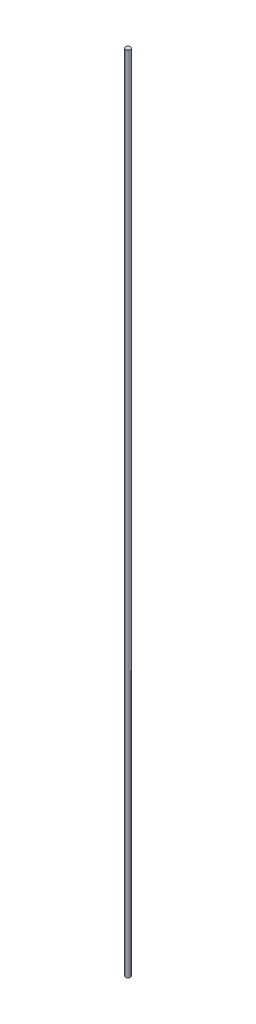
ISO-10303-21;
HEADER;
FILE_DESCRIPTION(('STEP AP214'),'2;1');
FILE_NAME('part.step','',(''),(''),'','','');
FILE_SCHEMA(('AUTOMOTIVE_DESIGN { 1 0 10303 214 1 1 1 1 }'));
ENDSEC;
DATA;
#1=APPLICATION_CONTEXT('core data for automotive mechanical design processes');
#2=APPLICATION_PROTOCOL_DEFINITION('international standard','automotive_design',2000,#1);
#3=PRODUCT_CONTEXT('',#1,'mechanical');
#4=PRODUCT('Part','Part','',(#3));
#5=PRODUCT_RELATED_PRODUCT_CATEGORY('part','',(#4));
#6=PRODUCT_DEFINITION_FORMATION('','',#4);
#7=PRODUCT_DEFINITION_CONTEXT('part definition',#1,'design');
#8=PRODUCT_DEFINITION('design','',#6,#7);
#9=PRODUCT_DEFINITION_SHAPE('','',#8);
#10=(LENGTH_UNIT() NAMED_UNIT(*) SI_UNIT(.MILLI.,.METRE.));
#11=(NAMED_UNIT(*) PLANE_ANGLE_UNIT() SI_UNIT($,.RADIAN.));
#12=(NAMED_UNIT(*) SI_UNIT($,.STERADIAN.) SOLID_ANGLE_UNIT());
#13=UNCERTAINTY_MEASURE_WITH_UNIT(LENGTH_MEASURE(1.E-05),#10,'distance_accuracy_value','');
#14=(GEOMETRIC_REPRESENTATION_CONTEXT(3) GLOBAL_UNCERTAINTY_ASSIGNED_CONTEXT((#13)) GLOBAL_UNIT_ASSIGNED_CONTEXT((#10,
#11,#12)) REPRESENTATION_CONTEXT('',''));
#15=CARTESIAN_POINT('',(0.,0.,0.));
#16=DIRECTION('',(0.,0.,1.));
#17=DIRECTION('',(1.,0.,0.));
#18=AXIS2_PLACEMENT_3D('',#15,#16,#17);
#19=CARTESIAN_POINT('',(0.,4033.,0.));
#20=DIRECTION('',(0.,-1.,0.));
#21=DIRECTION('',(0.,0.,-1.));
#22=AXIS2_PLACEMENT_3D('',#19,#20,#21);
#23=CYLINDRICAL_SURFACE('',#22,12.5);
#24=CARTESIAN_POINT('',(0.,4033.,0.));
#25=DIRECTION('',(0.,1.,0.));
#26=DIRECTION('',(0.,0.,1.));
#27=AXIS2_PLACEMENT_3D('',#24,#25,#26);
#28=CIRCLE('',#27,12.5);
#29=CARTESIAN_POINT('',(0.,4033.,12.5));
#30=VERTEX_POINT('',#29);
#31=EDGE_CURVE('E10',#30,#30,#28,.T.);
#32=ORIENTED_EDGE('',*,*,#31,.F.);
#33=EDGE_LOOP('',(#32));
#34=FACE_BOUND('',#33,.T.);
#35=CARTESIAN_POINT('',(0.,0.,0.));
#36=DIRECTION('',(0.,1.,0.));
#37=DIRECTION('',(0.,0.,1.));
#38=AXIS2_PLACEMENT_3D('',#35,#36,#37);
#39=CIRCLE('',#38,12.5);
#40=CARTESIAN_POINT('',(0.,0.,12.5));
#41=VERTEX_POINT('',#40);
#42=EDGE_CURVE('E34',#41,#41,#39,.T.);
#43=ORIENTED_EDGE('',*,*,#42,.T.);
#44=EDGE_LOOP('',(#43));
#45=FACE_BOUND('',#44,.T.);
#46=ADVANCED_FACE('F31',(#34,#45),#23,.T.);
#47=CARTESIAN_POINT('',(0.,4033.,0.));
#48=DIRECTION('',(0.,1.,0.));
#49=DIRECTION('',(0.,0.,1.));
#50=AXIS2_PLACEMENT_3D('',#47,#48,#49);
#51=PLANE('',#50);
#52=ORIENTED_EDGE('',*,*,#31,.T.);
#53=EDGE_LOOP('',(#52));
#54=FACE_BOUND('',#53,.T.);
#55=ADVANCED_FACE('F46',(#54),#51,.T.);
#56=CARTESIAN_POINT('',(0.,0.,0.));
#57=DIRECTION('',(0.,1.,0.));
#58=DIRECTION('',(0.,0.,1.));
#59=AXIS2_PLACEMENT_3D('',#56,#57,#58);
#60=PLANE('',#59);
#61=ORIENTED_EDGE('',*,*,#42,.F.);
#62=EDGE_LOOP('',(#61));
#63=FACE_BOUND('',#62,.T.);
#64=ADVANCED_FACE('F44',(#63),#60,.F.);
#65=CLOSED_SHELL('',(#46,#55,#64));
#66=MANIFOLD_SOLID_BREP('B2',#65);
#67=ADVANCED_BREP_SHAPE_REPRESENTATION('',(#18,#66),#14);
#68=SHAPE_DEFINITION_REPRESENTATION(#9,#67);
ENDSEC;
END-ISO-10303-21;
